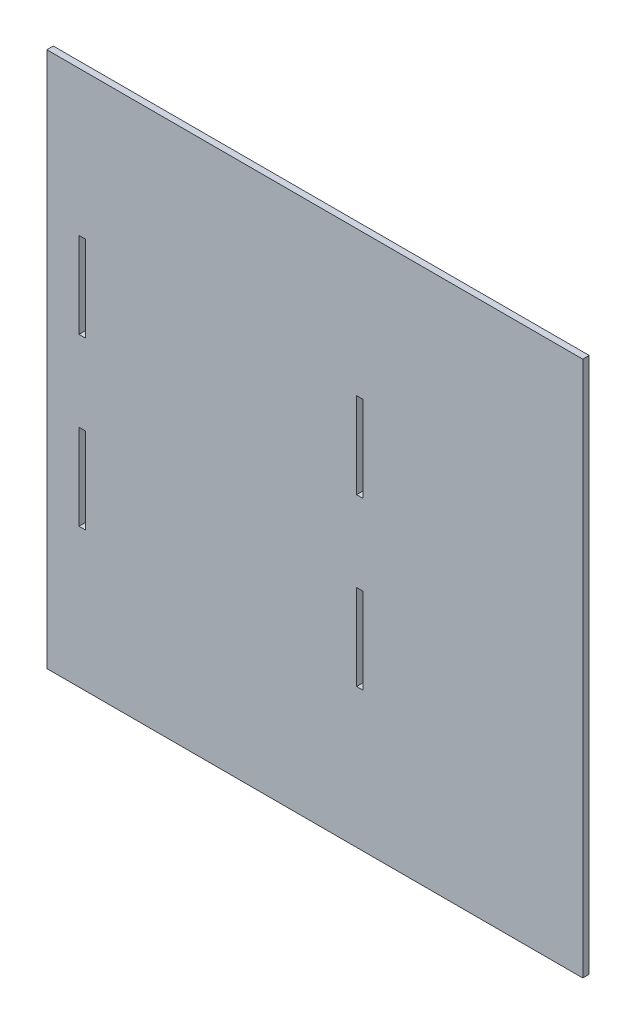
ISO-10303-21;
HEADER;
FILE_DESCRIPTION(('STEP AP214'),'2;1');
FILE_NAME('part.step','',(''),(''),'','','');
FILE_SCHEMA(('AUTOMOTIVE_DESIGN { 1 0 10303 214 1 1 1 1 }'));
ENDSEC;
DATA;
#1=APPLICATION_CONTEXT('core data for automotive mechanical design processes');
#2=APPLICATION_PROTOCOL_DEFINITION('international standard','automotive_design',2000,#1);
#3=PRODUCT_CONTEXT('',#1,'mechanical');
#4=PRODUCT('Part','Part','',(#3));
#5=PRODUCT_RELATED_PRODUCT_CATEGORY('part','',(#4));
#6=PRODUCT_DEFINITION_FORMATION('','',#4);
#7=PRODUCT_DEFINITION_CONTEXT('part definition',#1,'design');
#8=PRODUCT_DEFINITION('design','',#6,#7);
#9=PRODUCT_DEFINITION_SHAPE('','',#8);
#10=(LENGTH_UNIT() NAMED_UNIT(*) SI_UNIT(.MILLI.,.METRE.));
#11=(NAMED_UNIT(*) PLANE_ANGLE_UNIT() SI_UNIT($,.RADIAN.));
#12=(NAMED_UNIT(*) SI_UNIT($,.STERADIAN.) SOLID_ANGLE_UNIT());
#13=UNCERTAINTY_MEASURE_WITH_UNIT(LENGTH_MEASURE(1.E-05),#10,'distance_accuracy_value','');
#14=(GEOMETRIC_REPRESENTATION_CONTEXT(3) GLOBAL_UNCERTAINTY_ASSIGNED_CONTEXT((#13)) GLOBAL_UNIT_ASSIGNED_CONTEXT((#10,
#11,#12)) REPRESENTATION_CONTEXT('',''));
#15=CARTESIAN_POINT('',(0.,0.,0.));
#16=DIRECTION('',(0.,0.,1.));
#17=DIRECTION('',(1.,0.,0.));
#18=AXIS2_PLACEMENT_3D('',#15,#16,#17);
#19=CARTESIAN_POINT('',(0.,0.,6.));
#20=DIRECTION('',(0.,0.,-1.));
#21=DIRECTION('',(-1.,0.,0.));
#22=AXIS2_PLACEMENT_3D('',#19,#20,#21);
#23=PLANE('',#22);
#24=DIRECTION('',(0.,-1.,0.));
#25=VECTOR('',#24,1.);
#26=CARTESIAN_POINT('',(289.,365.,6.));
#27=LINE('',#26,#25);
#28=CARTESIAN_POINT('',(289.,365.,6.));
#29=VERTEX_POINT('',#28);
#30=CARTESIAN_POINT('',(289.,285.,6.));
#31=VERTEX_POINT('',#30);
#32=EDGE_CURVE('E225',#29,#31,#27,.T.);
#33=ORIENTED_EDGE('',*,*,#32,.F.);
#34=DIRECTION('',(-1.,0.,0.));
#35=VECTOR('',#34,1.);
#36=CARTESIAN_POINT('',(289.,365.,6.));
#37=LINE('',#36,#35);
#38=CARTESIAN_POINT('',(295.,365.,6.));
#39=VERTEX_POINT('',#38);
#40=EDGE_CURVE('E236',#39,#29,#37,.T.);
#41=ORIENTED_EDGE('',*,*,#40,.F.);
#42=DIRECTION('',(0.,1.,0.));
#43=VECTOR('',#42,1.);
#44=CARTESIAN_POINT('',(295.,365.,6.));
#45=LINE('',#44,#43);
#46=CARTESIAN_POINT('',(295.,285.,6.));
#47=VERTEX_POINT('',#46);
#48=EDGE_CURVE('E232',#47,#39,#45,.T.);
#49=ORIENTED_EDGE('',*,*,#48,.F.);
#50=DIRECTION('',(1.,0.,0.));
#51=VECTOR('',#50,1.);
#52=CARTESIAN_POINT('',(289.,285.,6.));
#53=LINE('',#52,#51);
#54=EDGE_CURVE('E228',#31,#47,#53,.T.);
#55=ORIENTED_EDGE('',*,*,#54,.F.);
#56=EDGE_LOOP('',(#33,#41,#49,#55));
#57=FACE_BOUND('',#56,.T.);
#58=DIRECTION('',(0.,-1.,0.));
#59=VECTOR('',#58,1.);
#60=CARTESIAN_POINT('',(30.,130.,6.));
#61=LINE('',#60,#59);
#62=CARTESIAN_POINT('',(30.,210.,6.));
#63=VERTEX_POINT('',#62);
#64=CARTESIAN_POINT('',(30.,130.,6.));
#65=VERTEX_POINT('',#64);
#66=EDGE_CURVE('E311',#63,#65,#61,.T.);
#67=ORIENTED_EDGE('',*,*,#66,.F.);
#68=DIRECTION('',(-1.,0.,0.));
#69=VECTOR('',#68,1.);
#70=CARTESIAN_POINT('',(30.,210.,6.));
#71=LINE('',#70,#69);
#72=CARTESIAN_POINT('',(36.,210.,6.));
#73=VERTEX_POINT('',#72);
#74=EDGE_CURVE('E322',#73,#63,#71,.T.);
#75=ORIENTED_EDGE('',*,*,#74,.F.);
#76=DIRECTION('',(0.,1.,0.));
#77=VECTOR('',#76,1.);
#78=CARTESIAN_POINT('',(36.,130.,6.));
#79=LINE('',#78,#77);
#80=CARTESIAN_POINT('',(36.,130.,6.));
#81=VERTEX_POINT('',#80);
#82=EDGE_CURVE('E318',#81,#73,#79,.T.);
#83=ORIENTED_EDGE('',*,*,#82,.F.);
#84=DIRECTION('',(1.,0.,0.));
#85=VECTOR('',#84,1.);
#86=CARTESIAN_POINT('',(30.,130.,6.));
#87=LINE('',#86,#85);
#88=EDGE_CURVE('E314',#65,#81,#87,.T.);
#89=ORIENTED_EDGE('',*,*,#88,.F.);
#90=EDGE_LOOP('',(#67,#75,#83,#89));
#91=FACE_BOUND('',#90,.T.);
#92=DIRECTION('',(0.,-1.,0.));
#93=VECTOR('',#92,1.);
#94=CARTESIAN_POINT('',(0.,0.,6.));
#95=LINE('',#94,#93);
#96=CARTESIAN_POINT('',(0.,500.,6.));
#97=VERTEX_POINT('',#96);
#98=CARTESIAN_POINT('',(0.,0.,6.));
#99=VERTEX_POINT('',#98);
#100=EDGE_CURVE('E354',#97,#99,#95,.T.);
#101=ORIENTED_EDGE('',*,*,#100,.T.);
#102=DIRECTION('',(1.,0.,0.));
#103=VECTOR('',#102,1.);
#104=CARTESIAN_POINT('',(0.,0.,6.));
#105=LINE('',#104,#103);
#106=CARTESIAN_POINT('',(500.,0.,6.));
#107=VERTEX_POINT('',#106);
#108=EDGE_CURVE('E358',#99,#107,#105,.T.);
#109=ORIENTED_EDGE('',*,*,#108,.T.);
#110=DIRECTION('',(0.,1.,0.));
#111=VECTOR('',#110,1.);
#112=CARTESIAN_POINT('',(500.,0.,6.));
#113=LINE('',#112,#111);
#114=CARTESIAN_POINT('',(500.,500.,6.));
#115=VERTEX_POINT('',#114);
#116=EDGE_CURVE('E362',#107,#115,#113,.T.);
#117=ORIENTED_EDGE('',*,*,#116,.T.);
#118=DIRECTION('',(-1.,0.,0.));
#119=VECTOR('',#118,1.);
#120=CARTESIAN_POINT('',(0.,500.,6.));
#121=LINE('',#120,#119);
#122=EDGE_CURVE('E365',#115,#97,#121,.T.);
#123=ORIENTED_EDGE('',*,*,#122,.T.);
#124=EDGE_LOOP('',(#101,#109,#117,#123));
#125=FACE_BOUND('',#124,.T.);
#126=DIRECTION('',(0.,-1.,0.));
#127=VECTOR('',#126,1.);
#128=CARTESIAN_POINT('',(30.,285.,6.));
#129=LINE('',#128,#127);
#130=CARTESIAN_POINT('',(30.,365.,6.));
#131=VERTEX_POINT('',#130);
#132=CARTESIAN_POINT('',(30.,285.,6.));
#133=VERTEX_POINT('',#132);
#134=EDGE_CURVE('E268',#131,#133,#129,.T.);
#135=ORIENTED_EDGE('',*,*,#134,.F.);
#136=DIRECTION('',(-1.,0.,0.));
#137=VECTOR('',#136,1.);
#138=CARTESIAN_POINT('',(30.,365.,6.));
#139=LINE('',#138,#137);
#140=CARTESIAN_POINT('',(36.,365.,6.));
#141=VERTEX_POINT('',#140);
#142=EDGE_CURVE('E279',#141,#131,#139,.T.);
#143=ORIENTED_EDGE('',*,*,#142,.F.);
#144=DIRECTION('',(0.,1.,0.));
#145=VECTOR('',#144,1.);
#146=CARTESIAN_POINT('',(36.,285.,6.));
#147=LINE('',#146,#145);
#148=CARTESIAN_POINT('',(36.,285.,6.));
#149=VERTEX_POINT('',#148);
#150=EDGE_CURVE('E275',#149,#141,#147,.T.);
#151=ORIENTED_EDGE('',*,*,#150,.F.);
#152=DIRECTION('',(1.,0.,0.));
#153=VECTOR('',#152,1.);
#154=CARTESIAN_POINT('',(30.,285.,6.));
#155=LINE('',#154,#153);
#156=EDGE_CURVE('E271',#133,#149,#155,.T.);
#157=ORIENTED_EDGE('',*,*,#156,.F.);
#158=EDGE_LOOP('',(#135,#143,#151,#157));
#159=FACE_BOUND('',#158,.T.);
#160=DIRECTION('',(0.,-1.,0.));
#161=VECTOR('',#160,1.);
#162=CARTESIAN_POINT('',(289.,210.,6.));
#163=LINE('',#162,#161);
#164=CARTESIAN_POINT('',(289.,210.,6.));
#165=VERTEX_POINT('',#164);
#166=CARTESIAN_POINT('',(289.,130.,6.));
#167=VERTEX_POINT('',#166);
#168=EDGE_CURVE('E177',#165,#167,#163,.T.);
#169=ORIENTED_EDGE('',*,*,#168,.F.);
#170=DIRECTION('',(-1.,0.,0.));
#171=VECTOR('',#170,1.);
#172=CARTESIAN_POINT('',(289.,210.,6.));
#173=LINE('',#172,#171);
#174=CARTESIAN_POINT('',(295.,210.,6.));
#175=VERTEX_POINT('',#174);
#176=EDGE_CURVE('E203',#175,#165,#173,.T.);
#177=ORIENTED_EDGE('',*,*,#176,.F.);
#178=DIRECTION('',(0.,1.,0.));
#179=VECTOR('',#178,1.);
#180=CARTESIAN_POINT('',(295.,210.,6.));
#181=LINE('',#180,#179);
#182=CARTESIAN_POINT('',(295.,130.,6.));
#183=VERTEX_POINT('',#182);
#184=EDGE_CURVE('E199',#183,#175,#181,.T.);
#185=ORIENTED_EDGE('',*,*,#184,.F.);
#186=DIRECTION('',(1.,0.,0.));
#187=VECTOR('',#186,1.);
#188=CARTESIAN_POINT('',(289.,130.,6.));
#189=LINE('',#188,#187);
#190=EDGE_CURVE('E186',#167,#183,#189,.T.);
#191=ORIENTED_EDGE('',*,*,#190,.F.);
#192=EDGE_LOOP('',(#169,#177,#185,#191));
#193=FACE_BOUND('',#192,.T.);
#194=ADVANCED_FACE('F39',(#57,#91,#125,#159,#193),#23,.F.);
#195=CARTESIAN_POINT('',(0.,0.,0.));
#196=DIRECTION('',(0.,0.,-1.));
#197=DIRECTION('',(-1.,0.,0.));
#198=AXIS2_PLACEMENT_3D('',#195,#196,#197);
#199=PLANE('',#198);
#200=DIRECTION('',(0.,-1.,0.));
#201=VECTOR('',#200,1.);
#202=CARTESIAN_POINT('',(0.,0.,0.));
#203=LINE('',#202,#201);
#204=CARTESIAN_POINT('',(0.,500.,0.));
#205=VERTEX_POINT('',#204);
#206=CARTESIAN_POINT('',(0.,0.,0.));
#207=VERTEX_POINT('',#206);
#208=EDGE_CURVE('E353',#205,#207,#203,.T.);
#209=ORIENTED_EDGE('',*,*,#208,.F.);
#210=DIRECTION('',(-1.,0.,0.));
#211=VECTOR('',#210,1.);
#212=CARTESIAN_POINT('',(0.,500.,0.));
#213=LINE('',#212,#211);
#214=CARTESIAN_POINT('',(500.,500.,0.));
#215=VERTEX_POINT('',#214);
#216=EDGE_CURVE('E359',#215,#205,#213,.T.);
#217=ORIENTED_EDGE('',*,*,#216,.F.);
#218=DIRECTION('',(0.,1.,0.));
#219=VECTOR('',#218,1.);
#220=CARTESIAN_POINT('',(500.,0.,0.));
#221=LINE('',#220,#219);
#222=CARTESIAN_POINT('',(500.,0.,0.));
#223=VERTEX_POINT('',#222);
#224=EDGE_CURVE('E375',#223,#215,#221,.T.);
#225=ORIENTED_EDGE('',*,*,#224,.F.);
#226=DIRECTION('',(1.,0.,0.));
#227=VECTOR('',#226,1.);
#228=CARTESIAN_POINT('',(0.,0.,0.));
#229=LINE('',#228,#227);
#230=EDGE_CURVE('E372',#207,#223,#229,.T.);
#231=ORIENTED_EDGE('',*,*,#230,.F.);
#232=EDGE_LOOP('',(#209,#217,#225,#231));
#233=FACE_BOUND('',#232,.T.);
#234=DIRECTION('',(-1.,0.,0.));
#235=VECTOR('',#234,1.);
#236=CARTESIAN_POINT('',(30.,210.,0.));
#237=LINE('',#236,#235);
#238=CARTESIAN_POINT('',(36.,210.,0.));
#239=VERTEX_POINT('',#238);
#240=CARTESIAN_POINT('',(30.,210.,0.));
#241=VERTEX_POINT('',#240);
#242=EDGE_CURVE('E315',#239,#241,#237,.T.);
#243=ORIENTED_EDGE('',*,*,#242,.T.);
#244=DIRECTION('',(0.,-1.,0.));
#245=VECTOR('',#244,1.);
#246=CARTESIAN_POINT('',(30.,130.,0.));
#247=LINE('',#246,#245);
#248=CARTESIAN_POINT('',(30.,130.,0.));
#249=VERTEX_POINT('',#248);
#250=EDGE_CURVE('E310',#241,#249,#247,.T.);
#251=ORIENTED_EDGE('',*,*,#250,.T.);
#252=DIRECTION('',(1.,0.,0.));
#253=VECTOR('',#252,1.);
#254=CARTESIAN_POINT('',(30.,130.,0.));
#255=LINE('',#254,#253);
#256=CARTESIAN_POINT('',(36.,130.,0.));
#257=VERTEX_POINT('',#256);
#258=EDGE_CURVE('E329',#249,#257,#255,.T.);
#259=ORIENTED_EDGE('',*,*,#258,.T.);
#260=DIRECTION('',(0.,1.,0.));
#261=VECTOR('',#260,1.);
#262=CARTESIAN_POINT('',(36.,130.,0.));
#263=LINE('',#262,#261);
#264=EDGE_CURVE('E333',#257,#239,#263,.T.);
#265=ORIENTED_EDGE('',*,*,#264,.T.);
#266=EDGE_LOOP('',(#243,#251,#259,#265));
#267=FACE_BOUND('',#266,.T.);
#268=DIRECTION('',(-1.,0.,0.));
#269=VECTOR('',#268,1.);
#270=CARTESIAN_POINT('',(30.,365.,0.));
#271=LINE('',#270,#269);
#272=CARTESIAN_POINT('',(36.,365.,0.));
#273=VERTEX_POINT('',#272);
#274=CARTESIAN_POINT('',(30.,365.,0.));
#275=VERTEX_POINT('',#274);
#276=EDGE_CURVE('E272',#273,#275,#271,.T.);
#277=ORIENTED_EDGE('',*,*,#276,.T.);
#278=DIRECTION('',(0.,-1.,0.));
#279=VECTOR('',#278,1.);
#280=CARTESIAN_POINT('',(30.,285.,0.));
#281=LINE('',#280,#279);
#282=CARTESIAN_POINT('',(30.,285.,0.));
#283=VERTEX_POINT('',#282);
#284=EDGE_CURVE('E267',#275,#283,#281,.T.);
#285=ORIENTED_EDGE('',*,*,#284,.T.);
#286=DIRECTION('',(1.,0.,0.));
#287=VECTOR('',#286,1.);
#288=CARTESIAN_POINT('',(30.,285.,0.));
#289=LINE('',#288,#287);
#290=CARTESIAN_POINT('',(36.,285.,0.));
#291=VERTEX_POINT('',#290);
#292=EDGE_CURVE('E286',#283,#291,#289,.T.);
#293=ORIENTED_EDGE('',*,*,#292,.T.);
#294=DIRECTION('',(0.,1.,0.));
#295=VECTOR('',#294,1.);
#296=CARTESIAN_POINT('',(36.,285.,0.));
#297=LINE('',#296,#295);
#298=EDGE_CURVE('E290',#291,#273,#297,.T.);
#299=ORIENTED_EDGE('',*,*,#298,.T.);
#300=EDGE_LOOP('',(#277,#285,#293,#299));
#301=FACE_BOUND('',#300,.T.);
#302=DIRECTION('',(-1.,0.,0.));
#303=VECTOR('',#302,1.);
#304=CARTESIAN_POINT('',(289.,365.,0.));
#305=LINE('',#304,#303);
#306=CARTESIAN_POINT('',(295.,365.,0.));
#307=VERTEX_POINT('',#306);
#308=CARTESIAN_POINT('',(289.,365.,0.));
#309=VERTEX_POINT('',#308);
#310=EDGE_CURVE('E229',#307,#309,#305,.T.);
#311=ORIENTED_EDGE('',*,*,#310,.T.);
#312=DIRECTION('',(0.,-1.,0.));
#313=VECTOR('',#312,1.);
#314=CARTESIAN_POINT('',(289.,365.,0.));
#315=LINE('',#314,#313);
#316=CARTESIAN_POINT('',(289.,285.,0.));
#317=VERTEX_POINT('',#316);
#318=EDGE_CURVE('E195',#309,#317,#315,.T.);
#319=ORIENTED_EDGE('',*,*,#318,.T.);
#320=DIRECTION('',(1.,0.,0.));
#321=VECTOR('',#320,1.);
#322=CARTESIAN_POINT('',(289.,285.,0.));
#323=LINE('',#322,#321);
#324=CARTESIAN_POINT('',(295.,285.,0.));
#325=VERTEX_POINT('',#324);
#326=EDGE_CURVE('E243',#317,#325,#323,.T.);
#327=ORIENTED_EDGE('',*,*,#326,.T.);
#328=DIRECTION('',(0.,1.,0.));
#329=VECTOR('',#328,1.);
#330=CARTESIAN_POINT('',(295.,365.,0.));
#331=LINE('',#330,#329);
#332=EDGE_CURVE('E247',#325,#307,#331,.T.);
#333=ORIENTED_EDGE('',*,*,#332,.T.);
#334=EDGE_LOOP('',(#311,#319,#327,#333));
#335=FACE_BOUND('',#334,.T.);
#336=DIRECTION('',(-1.,0.,0.));
#337=VECTOR('',#336,1.);
#338=CARTESIAN_POINT('',(289.,210.,0.));
#339=LINE('',#338,#337);
#340=CARTESIAN_POINT('',(295.,210.,0.));
#341=VERTEX_POINT('',#340);
#342=CARTESIAN_POINT('',(289.,210.,0.));
#343=VERTEX_POINT('',#342);
#344=EDGE_CURVE('E187',#341,#343,#339,.T.);
#345=ORIENTED_EDGE('',*,*,#344,.T.);
#346=DIRECTION('',(0.,-1.,0.));
#347=VECTOR('',#346,1.);
#348=CARTESIAN_POINT('',(289.,210.,0.));
#349=LINE('',#348,#347);
#350=CARTESIAN_POINT('',(289.,130.,0.));
#351=VERTEX_POINT('',#350);
#352=EDGE_CURVE('E63',#343,#351,#349,.T.);
#353=ORIENTED_EDGE('',*,*,#352,.T.);
#354=DIRECTION('',(1.,0.,0.));
#355=VECTOR('',#354,1.);
#356=CARTESIAN_POINT('',(289.,130.,0.));
#357=LINE('',#356,#355);
#358=CARTESIAN_POINT('',(295.,130.,0.));
#359=VERTEX_POINT('',#358);
#360=EDGE_CURVE('E193',#351,#359,#357,.T.);
#361=ORIENTED_EDGE('',*,*,#360,.T.);
#362=DIRECTION('',(0.,1.,0.));
#363=VECTOR('',#362,1.);
#364=CARTESIAN_POINT('',(295.,210.,0.));
#365=LINE('',#364,#363);
#366=EDGE_CURVE('E212',#359,#341,#365,.T.);
#367=ORIENTED_EDGE('',*,*,#366,.T.);
#368=EDGE_LOOP('',(#345,#353,#361,#367));
#369=FACE_BOUND('',#368,.T.);
#370=ADVANCED_FACE('F398',(#233,#267,#301,#335,#369),#199,.T.);
#371=CARTESIAN_POINT('',(0.,0.,6.));
#372=DIRECTION('',(1.,0.,0.));
#373=DIRECTION('',(0.,0.,-1.));
#374=AXIS2_PLACEMENT_3D('',#371,#372,#373);
#375=PLANE('',#374);
#376=ORIENTED_EDGE('',*,*,#208,.T.);
#377=DIRECTION('',(0.,0.,-1.));
#378=VECTOR('',#377,1.);
#379=CARTESIAN_POINT('',(0.,0.,6.));
#380=LINE('',#379,#378);
#381=EDGE_CURVE('E11',#99,#207,#380,.T.);
#382=ORIENTED_EDGE('',*,*,#381,.F.);
#383=ORIENTED_EDGE('',*,*,#100,.F.);
#384=DIRECTION('',(0.,0.,-1.));
#385=VECTOR('',#384,1.);
#386=CARTESIAN_POINT('',(0.,500.,6.));
#387=LINE('',#386,#385);
#388=EDGE_CURVE('E368',#97,#205,#387,.T.);
#389=ORIENTED_EDGE('',*,*,#388,.T.);
#390=EDGE_LOOP('',(#376,#382,#383,#389));
#391=FACE_BOUND('',#390,.T.);
#392=ADVANCED_FACE('F41',(#391),#375,.F.);
#393=CARTESIAN_POINT('',(0.,0.,6.));
#394=DIRECTION('',(0.,1.,0.));
#395=DIRECTION('',(0.,0.,1.));
#396=AXIS2_PLACEMENT_3D('',#393,#394,#395);
#397=PLANE('',#396);
#398=ORIENTED_EDGE('',*,*,#230,.T.);
#399=DIRECTION('',(0.,0.,-1.));
#400=VECTOR('',#399,1.);
#401=CARTESIAN_POINT('',(500.,0.,6.));
#402=LINE('',#401,#400);
#403=EDGE_CURVE('E48',#107,#223,#402,.T.);
#404=ORIENTED_EDGE('',*,*,#403,.F.);
#405=ORIENTED_EDGE('',*,*,#108,.F.);
#406=ORIENTED_EDGE('',*,*,#381,.T.);
#407=EDGE_LOOP('',(#398,#404,#405,#406));
#408=FACE_BOUND('',#407,.T.);
#409=ADVANCED_FACE('F409',(#408),#397,.F.);
#410=CARTESIAN_POINT('',(500.,0.,6.));
#411=DIRECTION('',(-1.,0.,0.));
#412=DIRECTION('',(0.,0.,1.));
#413=AXIS2_PLACEMENT_3D('',#410,#411,#412);
#414=PLANE('',#413);
#415=ORIENTED_EDGE('',*,*,#224,.T.);
#416=DIRECTION('',(0.,0.,-1.));
#417=VECTOR('',#416,1.);
#418=CARTESIAN_POINT('',(500.,500.,6.));
#419=LINE('',#418,#417);
#420=EDGE_CURVE('E383',#115,#215,#419,.T.);
#421=ORIENTED_EDGE('',*,*,#420,.F.);
#422=ORIENTED_EDGE('',*,*,#116,.F.);
#423=ORIENTED_EDGE('',*,*,#403,.T.);
#424=EDGE_LOOP('',(#415,#421,#422,#423));
#425=FACE_BOUND('',#424,.T.);
#426=ADVANCED_FACE('F392',(#425),#414,.F.);
#427=CARTESIAN_POINT('',(0.,500.,6.));
#428=DIRECTION('',(0.,-1.,0.));
#429=DIRECTION('',(0.,0.,-1.));
#430=AXIS2_PLACEMENT_3D('',#427,#428,#429);
#431=PLANE('',#430);
#432=ORIENTED_EDGE('',*,*,#216,.T.);
#433=ORIENTED_EDGE('',*,*,#388,.F.);
#434=ORIENTED_EDGE('',*,*,#122,.F.);
#435=ORIENTED_EDGE('',*,*,#420,.T.);
#436=EDGE_LOOP('',(#432,#433,#434,#435));
#437=FACE_BOUND('',#436,.T.);
#438=ADVANCED_FACE('F402',(#437),#431,.F.);
#439=CARTESIAN_POINT('',(30.,130.,6.));
#440=DIRECTION('',(1.,0.,0.));
#441=DIRECTION('',(0.,0.,-1.));
#442=AXIS2_PLACEMENT_3D('',#439,#440,#441);
#443=PLANE('',#442);
#444=ORIENTED_EDGE('',*,*,#250,.F.);
#445=DIRECTION('',(0.,0.,-1.));
#446=VECTOR('',#445,1.);
#447=CARTESIAN_POINT('',(30.,210.,6.));
#448=LINE('',#447,#446);
#449=EDGE_CURVE('E325',#63,#241,#448,.T.);
#450=ORIENTED_EDGE('',*,*,#449,.F.);
#451=ORIENTED_EDGE('',*,*,#66,.T.);
#452=DIRECTION('',(0.,0.,-1.));
#453=VECTOR('',#452,1.);
#454=CARTESIAN_POINT('',(30.,130.,6.));
#455=LINE('',#454,#453);
#456=EDGE_CURVE('E349',#65,#249,#455,.T.);
#457=ORIENTED_EDGE('',*,*,#456,.T.);
#458=EDGE_LOOP('',(#444,#450,#451,#457));
#459=FACE_BOUND('',#458,.T.);
#460=ADVANCED_FACE('F426',(#459),#443,.T.);
#461=CARTESIAN_POINT('',(30.,130.,6.));
#462=DIRECTION('',(0.,1.,0.));
#463=DIRECTION('',(0.,0.,1.));
#464=AXIS2_PLACEMENT_3D('',#461,#462,#463);
#465=PLANE('',#464);
#466=ORIENTED_EDGE('',*,*,#258,.F.);
#467=ORIENTED_EDGE('',*,*,#456,.F.);
#468=ORIENTED_EDGE('',*,*,#88,.T.);
#469=DIRECTION('',(0.,0.,-1.));
#470=VECTOR('',#469,1.);
#471=CARTESIAN_POINT('',(36.,130.,6.));
#472=LINE('',#471,#470);
#473=EDGE_CURVE('E346',#81,#257,#472,.T.);
#474=ORIENTED_EDGE('',*,*,#473,.T.);
#475=EDGE_LOOP('',(#466,#467,#468,#474));
#476=FACE_BOUND('',#475,.T.);
#477=ADVANCED_FACE('F433',(#476),#465,.T.);
#478=CARTESIAN_POINT('',(36.,130.,6.));
#479=DIRECTION('',(-1.,0.,0.));
#480=DIRECTION('',(0.,0.,1.));
#481=AXIS2_PLACEMENT_3D('',#478,#479,#480);
#482=PLANE('',#481);
#483=ORIENTED_EDGE('',*,*,#264,.F.);
#484=ORIENTED_EDGE('',*,*,#473,.F.);
#485=ORIENTED_EDGE('',*,*,#82,.T.);
#486=DIRECTION('',(0.,0.,-1.));
#487=VECTOR('',#486,1.);
#488=CARTESIAN_POINT('',(36.,210.,6.));
#489=LINE('',#488,#487);
#490=EDGE_CURVE('E343',#73,#239,#489,.T.);
#491=ORIENTED_EDGE('',*,*,#490,.T.);
#492=EDGE_LOOP('',(#483,#484,#485,#491));
#493=FACE_BOUND('',#492,.T.);
#494=ADVANCED_FACE('F438',(#493),#482,.T.);
#495=CARTESIAN_POINT('',(30.,210.,6.));
#496=DIRECTION('',(0.,-1.,0.));
#497=DIRECTION('',(0.,0.,-1.));
#498=AXIS2_PLACEMENT_3D('',#495,#496,#497);
#499=PLANE('',#498);
#500=ORIENTED_EDGE('',*,*,#242,.F.);
#501=ORIENTED_EDGE('',*,*,#490,.F.);
#502=ORIENTED_EDGE('',*,*,#74,.T.);
#503=ORIENTED_EDGE('',*,*,#449,.T.);
#504=EDGE_LOOP('',(#500,#501,#502,#503));
#505=FACE_BOUND('',#504,.T.);
#506=ADVANCED_FACE('F445',(#505),#499,.T.);
#507=CARTESIAN_POINT('',(30.,285.,6.));
#508=DIRECTION('',(1.,0.,0.));
#509=DIRECTION('',(0.,1.,0.));
#510=AXIS2_PLACEMENT_3D('',#507,#508,#509);
#511=PLANE('',#510);
#512=ORIENTED_EDGE('',*,*,#284,.F.);
#513=DIRECTION('',(0.,0.,-1.));
#514=VECTOR('',#513,1.);
#515=CARTESIAN_POINT('',(30.,365.,6.));
#516=LINE('',#515,#514);
#517=EDGE_CURVE('E282',#131,#275,#516,.T.);
#518=ORIENTED_EDGE('',*,*,#517,.F.);
#519=ORIENTED_EDGE('',*,*,#134,.T.);
#520=DIRECTION('',(0.,0.,-1.));
#521=VECTOR('',#520,1.);
#522=CARTESIAN_POINT('',(30.,285.,6.));
#523=LINE('',#522,#521);
#524=EDGE_CURVE('E306',#133,#283,#523,.T.);
#525=ORIENTED_EDGE('',*,*,#524,.T.);
#526=EDGE_LOOP('',(#512,#518,#519,#525));
#527=FACE_BOUND('',#526,.T.);
#528=ADVANCED_FACE('F458',(#527),#511,.T.);
#529=CARTESIAN_POINT('',(30.,285.,6.));
#530=DIRECTION('',(0.,1.,0.));
#531=DIRECTION('',(0.,0.,1.));
#532=AXIS2_PLACEMENT_3D('',#529,#530,#531);
#533=PLANE('',#532);
#534=ORIENTED_EDGE('',*,*,#292,.F.);
#535=ORIENTED_EDGE('',*,*,#524,.F.);
#536=ORIENTED_EDGE('',*,*,#156,.T.);
#537=DIRECTION('',(0.,0.,-1.));
#538=VECTOR('',#537,1.);
#539=CARTESIAN_POINT('',(36.,285.,6.));
#540=LINE('',#539,#538);
#541=EDGE_CURVE('E303',#149,#291,#540,.T.);
#542=ORIENTED_EDGE('',*,*,#541,.T.);
#543=EDGE_LOOP('',(#534,#535,#536,#542));
#544=FACE_BOUND('',#543,.T.);
#545=ADVANCED_FACE('F463',(#544),#533,.T.);
#546=CARTESIAN_POINT('',(36.,285.,6.));
#547=DIRECTION('',(-1.,0.,0.));
#548=DIRECTION('',(0.,0.,1.));
#549=AXIS2_PLACEMENT_3D('',#546,#547,#548);
#550=PLANE('',#549);
#551=ORIENTED_EDGE('',*,*,#298,.F.);
#552=ORIENTED_EDGE('',*,*,#541,.F.);
#553=ORIENTED_EDGE('',*,*,#150,.T.);
#554=DIRECTION('',(0.,0.,-1.));
#555=VECTOR('',#554,1.);
#556=CARTESIAN_POINT('',(36.,365.,6.));
#557=LINE('',#556,#555);
#558=EDGE_CURVE('E300',#141,#273,#557,.T.);
#559=ORIENTED_EDGE('',*,*,#558,.T.);
#560=EDGE_LOOP('',(#551,#552,#553,#559));
#561=FACE_BOUND('',#560,.T.);
#562=ADVANCED_FACE('F467',(#561),#550,.T.);
#563=CARTESIAN_POINT('',(30.,365.,6.));
#564=DIRECTION('',(0.,-1.,0.));
#565=DIRECTION('',(0.,0.,-1.));
#566=AXIS2_PLACEMENT_3D('',#563,#564,#565);
#567=PLANE('',#566);
#568=ORIENTED_EDGE('',*,*,#276,.F.);
#569=ORIENTED_EDGE('',*,*,#558,.F.);
#570=ORIENTED_EDGE('',*,*,#142,.T.);
#571=ORIENTED_EDGE('',*,*,#517,.T.);
#572=EDGE_LOOP('',(#568,#569,#570,#571));
#573=FACE_BOUND('',#572,.T.);
#574=ADVANCED_FACE('F471',(#573),#567,.T.);
#575=CARTESIAN_POINT('',(289.,365.,6.));
#576=DIRECTION('',(1.,0.,0.));
#577=DIRECTION('',(0.,0.,-1.));
#578=AXIS2_PLACEMENT_3D('',#575,#576,#577);
#579=PLANE('',#578);
#580=ORIENTED_EDGE('',*,*,#318,.F.);
#581=DIRECTION('',(0.,0.,-1.));
#582=VECTOR('',#581,1.);
#583=CARTESIAN_POINT('',(289.,365.,6.));
#584=LINE('',#583,#582);
#585=EDGE_CURVE('E239',#29,#309,#584,.T.);
#586=ORIENTED_EDGE('',*,*,#585,.F.);
#587=ORIENTED_EDGE('',*,*,#32,.T.);
#588=DIRECTION('',(0.,0.,-1.));
#589=VECTOR('',#588,1.);
#590=CARTESIAN_POINT('',(289.,285.,6.));
#591=LINE('',#590,#589);
#592=EDGE_CURVE('E263',#31,#317,#591,.T.);
#593=ORIENTED_EDGE('',*,*,#592,.T.);
#594=EDGE_LOOP('',(#580,#586,#587,#593));
#595=FACE_BOUND('',#594,.T.);
#596=ADVANCED_FACE('F475',(#595),#579,.T.);
#597=CARTESIAN_POINT('',(289.,285.,6.));
#598=DIRECTION('',(0.,1.,0.));
#599=DIRECTION('',(0.,0.,1.));
#600=AXIS2_PLACEMENT_3D('',#597,#598,#599);
#601=PLANE('',#600);
#602=ORIENTED_EDGE('',*,*,#326,.F.);
#603=ORIENTED_EDGE('',*,*,#592,.F.);
#604=ORIENTED_EDGE('',*,*,#54,.T.);
#605=DIRECTION('',(0.,0.,-1.));
#606=VECTOR('',#605,1.);
#607=CARTESIAN_POINT('',(295.,285.,6.));
#608=LINE('',#607,#606);
#609=EDGE_CURVE('E260',#47,#325,#608,.T.);
#610=ORIENTED_EDGE('',*,*,#609,.T.);
#611=EDGE_LOOP('',(#602,#603,#604,#610));
#612=FACE_BOUND('',#611,.T.);
#613=ADVANCED_FACE('F479',(#612),#601,.T.);
#614=CARTESIAN_POINT('',(295.,365.,6.));
#615=DIRECTION('',(-1.,0.,0.));
#616=DIRECTION('',(0.,0.,1.));
#617=AXIS2_PLACEMENT_3D('',#614,#615,#616);
#618=PLANE('',#617);
#619=ORIENTED_EDGE('',*,*,#332,.F.);
#620=ORIENTED_EDGE('',*,*,#609,.F.);
#621=ORIENTED_EDGE('',*,*,#48,.T.);
#622=DIRECTION('',(0.,0.,-1.));
#623=VECTOR('',#622,1.);
#624=CARTESIAN_POINT('',(295.,365.,6.));
#625=LINE('',#624,#623);
#626=EDGE_CURVE('E257',#39,#307,#625,.T.);
#627=ORIENTED_EDGE('',*,*,#626,.T.);
#628=EDGE_LOOP('',(#619,#620,#621,#627));
#629=FACE_BOUND('',#628,.T.);
#630=ADVANCED_FACE('F483',(#629),#618,.T.);
#631=CARTESIAN_POINT('',(289.,365.,6.));
#632=DIRECTION('',(0.,-1.,0.));
#633=DIRECTION('',(0.,0.,-1.));
#634=AXIS2_PLACEMENT_3D('',#631,#632,#633);
#635=PLANE('',#634);
#636=ORIENTED_EDGE('',*,*,#310,.F.);
#637=ORIENTED_EDGE('',*,*,#626,.F.);
#638=ORIENTED_EDGE('',*,*,#40,.T.);
#639=ORIENTED_EDGE('',*,*,#585,.T.);
#640=EDGE_LOOP('',(#636,#637,#638,#639));
#641=FACE_BOUND('',#640,.T.);
#642=ADVANCED_FACE('F487',(#641),#635,.T.);
#643=CARTESIAN_POINT('',(289.,210.,6.));
#644=DIRECTION('',(1.,0.,0.));
#645=DIRECTION('',(0.,0.,-1.));
#646=AXIS2_PLACEMENT_3D('',#643,#644,#645);
#647=PLANE('',#646);
#648=ORIENTED_EDGE('',*,*,#352,.F.);
#649=DIRECTION('',(0.,0.,-1.));
#650=VECTOR('',#649,1.);
#651=CARTESIAN_POINT('',(289.,210.,6.));
#652=LINE('',#651,#650);
#653=EDGE_CURVE('E181',#165,#343,#652,.T.);
#654=ORIENTED_EDGE('',*,*,#653,.F.);
#655=ORIENTED_EDGE('',*,*,#168,.T.);
#656=DIRECTION('',(0.,0.,-1.));
#657=VECTOR('',#656,1.);
#658=CARTESIAN_POINT('',(289.,130.,6.));
#659=LINE('',#658,#657);
#660=EDGE_CURVE('E180',#167,#351,#659,.T.);
#661=ORIENTED_EDGE('',*,*,#660,.T.);
#662=EDGE_LOOP('',(#648,#654,#655,#661));
#663=FACE_BOUND('',#662,.T.);
#664=ADVANCED_FACE('F179',(#663),#647,.T.);
#665=CARTESIAN_POINT('',(289.,130.,6.));
#666=DIRECTION('',(0.,1.,0.));
#667=DIRECTION('',(0.,0.,1.));
#668=AXIS2_PLACEMENT_3D('',#665,#666,#667);
#669=PLANE('',#668);
#670=ORIENTED_EDGE('',*,*,#360,.F.);
#671=ORIENTED_EDGE('',*,*,#660,.F.);
#672=ORIENTED_EDGE('',*,*,#190,.T.);
#673=DIRECTION('',(0.,0.,-1.));
#674=VECTOR('',#673,1.);
#675=CARTESIAN_POINT('',(295.,130.,6.));
#676=LINE('',#675,#674);
#677=EDGE_CURVE('E196',#183,#359,#676,.T.);
#678=ORIENTED_EDGE('',*,*,#677,.T.);
#679=EDGE_LOOP('',(#670,#671,#672,#678));
#680=FACE_BOUND('',#679,.T.);
#681=ADVANCED_FACE('F190',(#680),#669,.T.);
#682=CARTESIAN_POINT('',(295.,210.,6.));
#683=DIRECTION('',(-1.,0.,0.));
#684=DIRECTION('',(0.,0.,1.));
#685=AXIS2_PLACEMENT_3D('',#682,#683,#684);
#686=PLANE('',#685);
#687=ORIENTED_EDGE('',*,*,#366,.F.);
#688=ORIENTED_EDGE('',*,*,#677,.F.);
#689=ORIENTED_EDGE('',*,*,#184,.T.);
#690=DIRECTION('',(0.,0.,-1.));
#691=VECTOR('',#690,1.);
#692=CARTESIAN_POINT('',(295.,210.,6.));
#693=LINE('',#692,#691);
#694=EDGE_CURVE('E55',#175,#341,#693,.T.);
#695=ORIENTED_EDGE('',*,*,#694,.T.);
#696=EDGE_LOOP('',(#687,#688,#689,#695));
#697=FACE_BOUND('',#696,.T.);
#698=ADVANCED_FACE('F496',(#697),#686,.T.);
#699=CARTESIAN_POINT('',(289.,210.,6.));
#700=DIRECTION('',(0.,-1.,0.));
#701=DIRECTION('',(1.,0.,0.));
#702=AXIS2_PLACEMENT_3D('',#699,#700,#701);
#703=PLANE('',#702);
#704=ORIENTED_EDGE('',*,*,#344,.F.);
#705=ORIENTED_EDGE('',*,*,#694,.F.);
#706=ORIENTED_EDGE('',*,*,#176,.T.);
#707=ORIENTED_EDGE('',*,*,#653,.T.);
#708=EDGE_LOOP('',(#704,#705,#706,#707));
#709=FACE_BOUND('',#708,.T.);
#710=ADVANCED_FACE('F499',(#709),#703,.T.);
#711=CLOSED_SHELL('',(#194,#370,#392,#409,#426,#438,#460,#477,#494,#506,#528,#545,#562,#574,
#596,#613,#630,#642,#664,#681,#698,#710));
#712=MANIFOLD_SOLID_BREP('B2',#711);
#713=ADVANCED_BREP_SHAPE_REPRESENTATION('',(#18,#712),#14);
#714=SHAPE_DEFINITION_REPRESENTATION(#9,#713);
ENDSEC;
END-ISO-10303-21;
